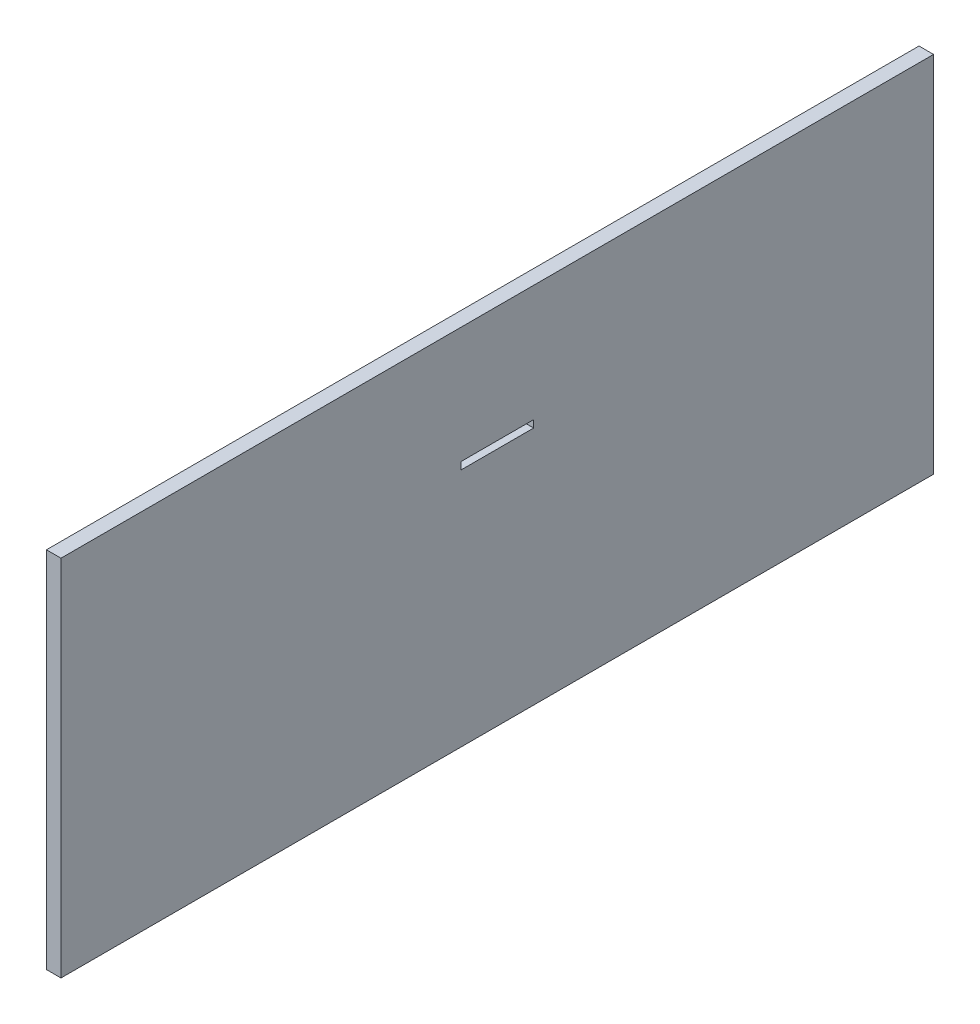
ISO-10303-21;
HEADER;
FILE_DESCRIPTION(('STEP AP214'),'2;1');
FILE_NAME('part.step','',(''),(''),'','','');
FILE_SCHEMA(('AUTOMOTIVE_DESIGN { 1 0 10303 214 1 1 1 1 }'));
ENDSEC;
DATA;
#1=APPLICATION_CONTEXT('core data for automotive mechanical design processes');
#2=APPLICATION_PROTOCOL_DEFINITION('international standard','automotive_design',2000,#1);
#3=PRODUCT_CONTEXT('',#1,'mechanical');
#4=PRODUCT('Part','Part','',(#3));
#5=PRODUCT_RELATED_PRODUCT_CATEGORY('part','',(#4));
#6=PRODUCT_DEFINITION_FORMATION('','',#4);
#7=PRODUCT_DEFINITION_CONTEXT('part definition',#1,'design');
#8=PRODUCT_DEFINITION('design','',#6,#7);
#9=PRODUCT_DEFINITION_SHAPE('','',#8);
#10=(LENGTH_UNIT() NAMED_UNIT(*) SI_UNIT(.MILLI.,.METRE.));
#11=(NAMED_UNIT(*) PLANE_ANGLE_UNIT() SI_UNIT($,.RADIAN.));
#12=(NAMED_UNIT(*) SI_UNIT($,.STERADIAN.) SOLID_ANGLE_UNIT());
#13=UNCERTAINTY_MEASURE_WITH_UNIT(LENGTH_MEASURE(1.E-05),#10,'distance_accuracy_value','');
#14=(GEOMETRIC_REPRESENTATION_CONTEXT(3) GLOBAL_UNCERTAINTY_ASSIGNED_CONTEXT((#13)) GLOBAL_UNIT_ASSIGNED_CONTEXT((#10,
#11,#12)) REPRESENTATION_CONTEXT('',''));
#15=CARTESIAN_POINT('',(0.,0.,0.));
#16=DIRECTION('',(0.,0.,1.));
#17=DIRECTION('',(1.,0.,0.));
#18=AXIS2_PLACEMENT_3D('',#15,#16,#17);
#19=CARTESIAN_POINT('',(10.,0.,0.));
#20=DIRECTION('',(1.,0.,0.));
#21=DIRECTION('',(0.,0.,-1.));
#22=AXIS2_PLACEMENT_3D('',#19,#20,#21);
#23=PLANE('',#22);
#24=DIRECTION('',(0.,-1.,0.));
#25=VECTOR('',#24,1.);
#26=CARTESIAN_POINT('',(10.,7.23562152133584,0.));
#27=LINE('',#26,#25);
#28=CARTESIAN_POINT('',(10.,7.23562152133584,0.));
#29=VERTEX_POINT('',#28);
#30=CARTESIAN_POINT('',(10.,-242.764378478664,0.));
#31=VERTEX_POINT('',#30);
#32=EDGE_CURVE('E153',#29,#31,#27,.T.);
#33=ORIENTED_EDGE('',*,*,#32,.T.);
#34=DIRECTION('',(0.,0.,-1.));
#35=VECTOR('',#34,1.);
#36=CARTESIAN_POINT('',(10.,-242.764378478664,0.));
#37=LINE('',#36,#35);
#38=CARTESIAN_POINT('',(10.,-242.764378478664,-600.));
#39=VERTEX_POINT('',#38);
#40=EDGE_CURVE('E157',#31,#39,#37,.T.);
#41=ORIENTED_EDGE('',*,*,#40,.T.);
#42=DIRECTION('',(0.,1.,0.));
#43=VECTOR('',#42,1.);
#44=CARTESIAN_POINT('',(10.,7.23562152133584,-600.));
#45=LINE('',#44,#43);
#46=CARTESIAN_POINT('',(10.,7.23562152133584,-600.));
#47=VERTEX_POINT('',#46);
#48=EDGE_CURVE('E161',#39,#47,#45,.T.);
#49=ORIENTED_EDGE('',*,*,#48,.T.);
#50=DIRECTION('',(0.,0.,1.));
#51=VECTOR('',#50,1.);
#52=CARTESIAN_POINT('',(10.,7.23562152133584,0.));
#53=LINE('',#52,#51);
#54=EDGE_CURVE('E164',#47,#29,#53,.T.);
#55=ORIENTED_EDGE('',*,*,#54,.T.);
#56=EDGE_LOOP('',(#33,#41,#49,#55));
#57=FACE_BOUND('',#56,.T.);
#58=DIRECTION('',(0.,0.,-1.));
#59=VECTOR('',#58,1.);
#60=CARTESIAN_POINT('',(10.,-77.7643784786642,-275.));
#61=LINE('',#60,#59);
#62=CARTESIAN_POINT('',(10.,-77.7643784786642,-275.));
#63=VERTEX_POINT('',#62);
#64=CARTESIAN_POINT('',(10.,-77.7643784786642,-325.));
#65=VERTEX_POINT('',#64);
#66=EDGE_CURVE('E114',#63,#65,#61,.T.);
#67=ORIENTED_EDGE('',*,*,#66,.F.);
#68=DIRECTION('',(0.,-1.,0.));
#69=VECTOR('',#68,1.);
#70=CARTESIAN_POINT('',(10.,-72.7643784786642,-275.));
#71=LINE('',#70,#69);
#72=CARTESIAN_POINT('',(10.,-72.7643784786642,-275.));
#73=VERTEX_POINT('',#72);
#74=EDGE_CURVE('E105',#73,#63,#71,.T.);
#75=ORIENTED_EDGE('',*,*,#74,.F.);
#76=DIRECTION('',(0.,0.,1.));
#77=VECTOR('',#76,1.);
#78=CARTESIAN_POINT('',(10.,-72.7643784786642,-275.));
#79=LINE('',#78,#77);
#80=CARTESIAN_POINT('',(10.,-72.7643784786642,-325.));
#81=VERTEX_POINT('',#80);
#82=EDGE_CURVE('E131',#81,#73,#79,.T.);
#83=ORIENTED_EDGE('',*,*,#82,.F.);
#84=DIRECTION('',(0.,1.,0.));
#85=VECTOR('',#84,1.);
#86=CARTESIAN_POINT('',(10.,-72.7643784786642,-325.));
#87=LINE('',#86,#85);
#88=EDGE_CURVE('E127',#65,#81,#87,.T.);
#89=ORIENTED_EDGE('',*,*,#88,.F.);
#90=EDGE_LOOP('',(#67,#75,#83,#89));
#91=FACE_BOUND('',#90,.T.);
#92=ADVANCED_FACE('F39',(#57,#91),#23,.T.);
#93=CARTESIAN_POINT('',(0.,0.,0.));
#94=DIRECTION('',(1.,0.,0.));
#95=DIRECTION('',(0.,0.,-1.));
#96=AXIS2_PLACEMENT_3D('',#93,#94,#95);
#97=PLANE('',#96);
#98=DIRECTION('',(0.,-1.,0.));
#99=VECTOR('',#98,1.);
#100=CARTESIAN_POINT('',(0.,7.23562152133584,0.));
#101=LINE('',#100,#99);
#102=CARTESIAN_POINT('',(0.,7.23562152133584,0.));
#103=VERTEX_POINT('',#102);
#104=CARTESIAN_POINT('',(0.,-242.764378478664,0.));
#105=VERTEX_POINT('',#104);
#106=EDGE_CURVE('E123',#103,#105,#101,.T.);
#107=ORIENTED_EDGE('',*,*,#106,.F.);
#108=DIRECTION('',(0.,0.,1.));
#109=VECTOR('',#108,1.);
#110=CARTESIAN_POINT('',(0.,7.23562152133584,0.));
#111=LINE('',#110,#109);
#112=CARTESIAN_POINT('',(0.,7.23562152133584,-600.));
#113=VERTEX_POINT('',#112);
#114=EDGE_CURVE('E158',#113,#103,#111,.T.);
#115=ORIENTED_EDGE('',*,*,#114,.F.);
#116=DIRECTION('',(0.,1.,0.));
#117=VECTOR('',#116,1.);
#118=CARTESIAN_POINT('',(0.,7.23562152133584,-600.));
#119=LINE('',#118,#117);
#120=CARTESIAN_POINT('',(0.,-242.764378478664,-600.));
#121=VERTEX_POINT('',#120);
#122=EDGE_CURVE('E174',#121,#113,#119,.T.);
#123=ORIENTED_EDGE('',*,*,#122,.F.);
#124=DIRECTION('',(0.,0.,-1.));
#125=VECTOR('',#124,1.);
#126=CARTESIAN_POINT('',(0.,-242.764378478664,0.));
#127=LINE('',#126,#125);
#128=EDGE_CURVE('E171',#105,#121,#127,.T.);
#129=ORIENTED_EDGE('',*,*,#128,.F.);
#130=EDGE_LOOP('',(#107,#115,#123,#129));
#131=FACE_BOUND('',#130,.T.);
#132=DIRECTION('',(0.,-1.,0.));
#133=VECTOR('',#132,1.);
#134=CARTESIAN_POINT('',(0.,-72.7643784786642,-275.));
#135=LINE('',#134,#133);
#136=CARTESIAN_POINT('',(0.,-72.7643784786642,-275.));
#137=VERTEX_POINT('',#136);
#138=CARTESIAN_POINT('',(0.,-77.7643784786642,-275.));
#139=VERTEX_POINT('',#138);
#140=EDGE_CURVE('E63',#137,#139,#135,.T.);
#141=ORIENTED_EDGE('',*,*,#140,.T.);
#142=DIRECTION('',(0.,0.,-1.));
#143=VECTOR('',#142,1.);
#144=CARTESIAN_POINT('',(0.,-77.7643784786642,-275.));
#145=LINE('',#144,#143);
#146=CARTESIAN_POINT('',(0.,-77.7643784786642,-325.));
#147=VERTEX_POINT('',#146);
#148=EDGE_CURVE('E121',#139,#147,#145,.T.);
#149=ORIENTED_EDGE('',*,*,#148,.T.);
#150=DIRECTION('',(0.,1.,0.));
#151=VECTOR('',#150,1.);
#152=CARTESIAN_POINT('',(0.,-72.7643784786642,-325.));
#153=LINE('',#152,#151);
#154=CARTESIAN_POINT('',(0.,-72.7643784786642,-325.));
#155=VERTEX_POINT('',#154);
#156=EDGE_CURVE('E140',#147,#155,#153,.T.);
#157=ORIENTED_EDGE('',*,*,#156,.T.);
#158=DIRECTION('',(0.,0.,1.));
#159=VECTOR('',#158,1.);
#160=CARTESIAN_POINT('',(0.,-72.7643784786642,-275.));
#161=LINE('',#160,#159);
#162=EDGE_CURVE('E115',#155,#137,#161,.T.);
#163=ORIENTED_EDGE('',*,*,#162,.T.);
#164=EDGE_LOOP('',(#141,#149,#157,#163));
#165=FACE_BOUND('',#164,.T.);
#166=ADVANCED_FACE('F197',(#131,#165),#97,.F.);
#167=CARTESIAN_POINT('',(10.,7.23562152133584,0.));
#168=DIRECTION('',(0.,0.,-1.));
#169=DIRECTION('',(0.,1.,0.));
#170=AXIS2_PLACEMENT_3D('',#167,#168,#169);
#171=PLANE('',#170);
#172=ORIENTED_EDGE('',*,*,#106,.T.);
#173=DIRECTION('',(-1.,0.,0.));
#174=VECTOR('',#173,1.);
#175=CARTESIAN_POINT('',(10.,-242.764378478664,0.));
#176=LINE('',#175,#174);
#177=EDGE_CURVE('E11',#31,#105,#176,.T.);
#178=ORIENTED_EDGE('',*,*,#177,.F.);
#179=ORIENTED_EDGE('',*,*,#32,.F.);
#180=DIRECTION('',(-1.,0.,0.));
#181=VECTOR('',#180,1.);
#182=CARTESIAN_POINT('',(10.,7.23562152133584,0.));
#183=LINE('',#182,#181);
#184=EDGE_CURVE('E167',#29,#103,#183,.T.);
#185=ORIENTED_EDGE('',*,*,#184,.T.);
#186=EDGE_LOOP('',(#172,#178,#179,#185));
#187=FACE_BOUND('',#186,.T.);
#188=ADVANCED_FACE('F41',(#187),#171,.F.);
#189=CARTESIAN_POINT('',(10.,-242.764378478664,0.));
#190=DIRECTION('',(0.,1.,0.));
#191=DIRECTION('',(0.,0.,1.));
#192=AXIS2_PLACEMENT_3D('',#189,#190,#191);
#193=PLANE('',#192);
#194=ORIENTED_EDGE('',*,*,#128,.T.);
#195=DIRECTION('',(-1.,0.,0.));
#196=VECTOR('',#195,1.);
#197=CARTESIAN_POINT('',(10.,-242.764378478664,-600.));
#198=LINE('',#197,#196);
#199=EDGE_CURVE('E48',#39,#121,#198,.T.);
#200=ORIENTED_EDGE('',*,*,#199,.F.);
#201=ORIENTED_EDGE('',*,*,#40,.F.);
#202=ORIENTED_EDGE('',*,*,#177,.T.);
#203=EDGE_LOOP('',(#194,#200,#201,#202));
#204=FACE_BOUND('',#203,.T.);
#205=ADVANCED_FACE('F207',(#204),#193,.F.);
#206=CARTESIAN_POINT('',(10.,7.23562152133584,-600.));
#207=DIRECTION('',(0.,0.,1.));
#208=DIRECTION('',(1.,0.,0.));
#209=AXIS2_PLACEMENT_3D('',#206,#207,#208);
#210=PLANE('',#209);
#211=ORIENTED_EDGE('',*,*,#122,.T.);
#212=DIRECTION('',(-1.,0.,0.));
#213=VECTOR('',#212,1.);
#214=CARTESIAN_POINT('',(10.,7.23562152133584,-600.));
#215=LINE('',#214,#213);
#216=EDGE_CURVE('E182',#47,#113,#215,.T.);
#217=ORIENTED_EDGE('',*,*,#216,.F.);
#218=ORIENTED_EDGE('',*,*,#48,.F.);
#219=ORIENTED_EDGE('',*,*,#199,.T.);
#220=EDGE_LOOP('',(#211,#217,#218,#219));
#221=FACE_BOUND('',#220,.T.);
#222=ADVANCED_FACE('F191',(#221),#210,.F.);
#223=CARTESIAN_POINT('',(10.,7.23562152133584,0.));
#224=DIRECTION('',(0.,-1.,0.));
#225=DIRECTION('',(0.,0.,-1.));
#226=AXIS2_PLACEMENT_3D('',#223,#224,#225);
#227=PLANE('',#226);
#228=ORIENTED_EDGE('',*,*,#114,.T.);
#229=ORIENTED_EDGE('',*,*,#184,.F.);
#230=ORIENTED_EDGE('',*,*,#54,.F.);
#231=ORIENTED_EDGE('',*,*,#216,.T.);
#232=EDGE_LOOP('',(#228,#229,#230,#231));
#233=FACE_BOUND('',#232,.T.);
#234=ADVANCED_FACE('F201',(#233),#227,.F.);
#235=CARTESIAN_POINT('',(10.,-72.7643784786642,-275.));
#236=DIRECTION('',(0.,0.,-1.));
#237=DIRECTION('',(0.,1.,0.));
#238=AXIS2_PLACEMENT_3D('',#235,#236,#237);
#239=PLANE('',#238);
#240=ORIENTED_EDGE('',*,*,#140,.F.);
#241=DIRECTION('',(-1.,0.,0.));
#242=VECTOR('',#241,1.);
#243=CARTESIAN_POINT('',(10.,-72.7643784786642,-275.));
#244=LINE('',#243,#242);
#245=EDGE_CURVE('E109',#73,#137,#244,.T.);
#246=ORIENTED_EDGE('',*,*,#245,.F.);
#247=ORIENTED_EDGE('',*,*,#74,.T.);
#248=DIRECTION('',(-1.,0.,0.));
#249=VECTOR('',#248,1.);
#250=CARTESIAN_POINT('',(10.,-77.7643784786642,-275.));
#251=LINE('',#250,#249);
#252=EDGE_CURVE('E108',#63,#139,#251,.T.);
#253=ORIENTED_EDGE('',*,*,#252,.T.);
#254=EDGE_LOOP('',(#240,#246,#247,#253));
#255=FACE_BOUND('',#254,.T.);
#256=ADVANCED_FACE('F107',(#255),#239,.T.);
#257=CARTESIAN_POINT('',(10.,-77.7643784786642,-275.));
#258=DIRECTION('',(0.,1.,0.));
#259=DIRECTION('',(0.,0.,1.));
#260=AXIS2_PLACEMENT_3D('',#257,#258,#259);
#261=PLANE('',#260);
#262=ORIENTED_EDGE('',*,*,#148,.F.);
#263=ORIENTED_EDGE('',*,*,#252,.F.);
#264=ORIENTED_EDGE('',*,*,#66,.T.);
#265=DIRECTION('',(-1.,0.,0.));
#266=VECTOR('',#265,1.);
#267=CARTESIAN_POINT('',(10.,-77.7643784786642,-325.));
#268=LINE('',#267,#266);
#269=EDGE_CURVE('E124',#65,#147,#268,.T.);
#270=ORIENTED_EDGE('',*,*,#269,.T.);
#271=EDGE_LOOP('',(#262,#263,#264,#270));
#272=FACE_BOUND('',#271,.T.);
#273=ADVANCED_FACE('F118',(#272),#261,.T.);
#274=CARTESIAN_POINT('',(10.,-72.7643784786642,-325.));
#275=DIRECTION('',(0.,0.,1.));
#276=DIRECTION('',(1.,0.,0.));
#277=AXIS2_PLACEMENT_3D('',#274,#275,#276);
#278=PLANE('',#277);
#279=ORIENTED_EDGE('',*,*,#156,.F.);
#280=ORIENTED_EDGE('',*,*,#269,.F.);
#281=ORIENTED_EDGE('',*,*,#88,.T.);
#282=DIRECTION('',(-1.,0.,0.));
#283=VECTOR('',#282,1.);
#284=CARTESIAN_POINT('',(10.,-72.7643784786642,-325.));
#285=LINE('',#284,#283);
#286=EDGE_CURVE('E55',#81,#155,#285,.T.);
#287=ORIENTED_EDGE('',*,*,#286,.T.);
#288=EDGE_LOOP('',(#279,#280,#281,#287));
#289=FACE_BOUND('',#288,.T.);
#290=ADVANCED_FACE('F230',(#289),#278,.T.);
#291=CARTESIAN_POINT('',(10.,-72.7643784786642,-275.));
#292=DIRECTION('',(0.,-1.,0.));
#293=DIRECTION('',(0.,0.,-1.));
#294=AXIS2_PLACEMENT_3D('',#291,#292,#293);
#295=PLANE('',#294);
#296=ORIENTED_EDGE('',*,*,#162,.F.);
#297=ORIENTED_EDGE('',*,*,#286,.F.);
#298=ORIENTED_EDGE('',*,*,#82,.T.);
#299=ORIENTED_EDGE('',*,*,#245,.T.);
#300=EDGE_LOOP('',(#296,#297,#298,#299));
#301=FACE_BOUND('',#300,.T.);
#302=ADVANCED_FACE('F234',(#301),#295,.T.);
#303=CLOSED_SHELL('',(#92,#166,#188,#205,#222,#234,#256,#273,#290,#302));
#304=MANIFOLD_SOLID_BREP('B2',#303);
#305=ADVANCED_BREP_SHAPE_REPRESENTATION('',(#18,#304),#14);
#306=SHAPE_DEFINITION_REPRESENTATION(#9,#305);
ENDSEC;
END-ISO-10303-21;
